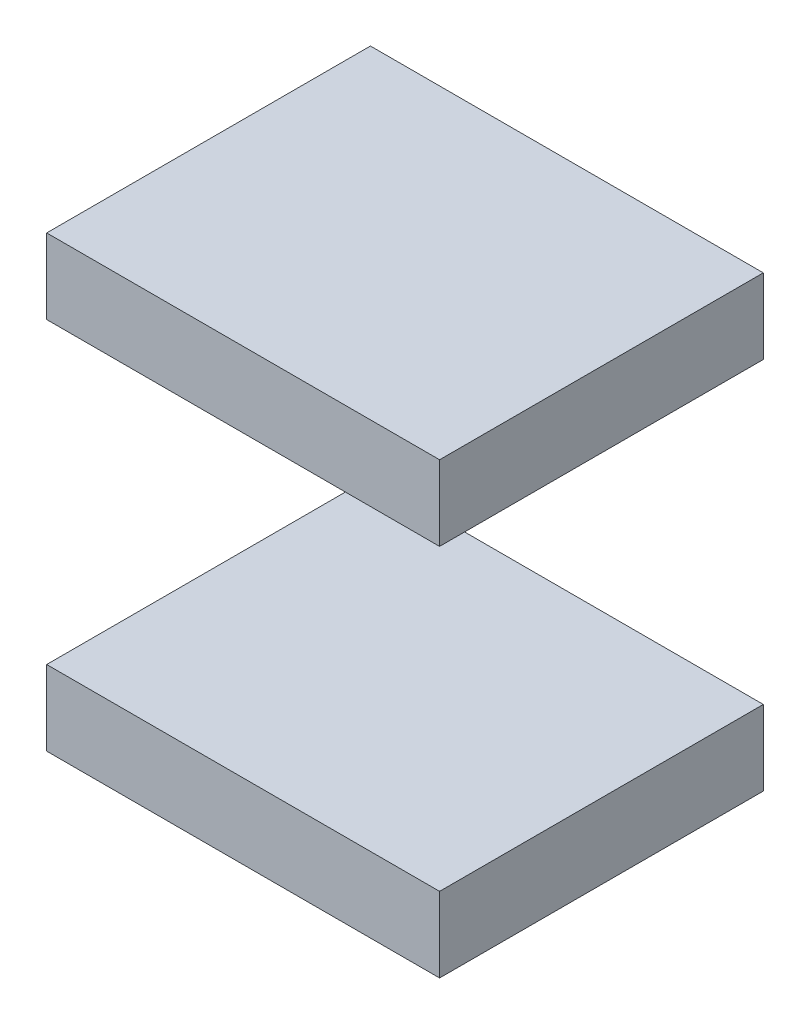
ISO-10303-21;
HEADER;
FILE_DESCRIPTION(('STEP AP214'),'2;1');
FILE_NAME('part.step','',(''),(''),'','','');
FILE_SCHEMA(('AUTOMOTIVE_DESIGN { 1 0 10303 214 1 1 1 1 }'));
ENDSEC;
DATA;
#1=APPLICATION_CONTEXT('core data for automotive mechanical design processes');
#2=APPLICATION_PROTOCOL_DEFINITION('international standard','automotive_design',2000,#1);
#3=PRODUCT_CONTEXT('',#1,'mechanical');
#4=PRODUCT('Part','Part','',(#3));
#5=PRODUCT_RELATED_PRODUCT_CATEGORY('part','',(#4));
#6=PRODUCT_DEFINITION_FORMATION('','',#4);
#7=PRODUCT_DEFINITION_CONTEXT('part definition',#1,'design');
#8=PRODUCT_DEFINITION('design','',#6,#7);
#9=PRODUCT_DEFINITION_SHAPE('','',#8);
#10=(LENGTH_UNIT() NAMED_UNIT(*) SI_UNIT(.MILLI.,.METRE.));
#11=(NAMED_UNIT(*) PLANE_ANGLE_UNIT() SI_UNIT($,.RADIAN.));
#12=(NAMED_UNIT(*) SI_UNIT($,.STERADIAN.) SOLID_ANGLE_UNIT());
#13=UNCERTAINTY_MEASURE_WITH_UNIT(LENGTH_MEASURE(1.E-05),#10,'distance_accuracy_value','');
#14=(GEOMETRIC_REPRESENTATION_CONTEXT(3) GLOBAL_UNCERTAINTY_ASSIGNED_CONTEXT((#13)) GLOBAL_UNIT_ASSIGNED_CONTEXT((#10,
#11,#12)) REPRESENTATION_CONTEXT('',''));
#15=CARTESIAN_POINT('',(0.,0.,0.));
#16=DIRECTION('',(0.,0.,1.));
#17=DIRECTION('',(1.,0.,0.));
#18=AXIS2_PLACEMENT_3D('',#15,#16,#17);
#19=CARTESIAN_POINT('',(53.665001201815,72.02500058408,0.));
#20=DIRECTION('',(-1.19248806385E-08,1.,0.));
#21=DIRECTION('',(-1.,-1.19248806385E-08,0.));
#22=AXIS2_PLACEMENT_3D('',#19,#20,#21);
#23=PLANE('',#22);
#24=DIRECTION('',(1.,0.,0.));
#25=VECTOR('',#24,1.);
#26=CARTESIAN_POINT('',(58.665001198953,72.02500061592,2.4));
#27=LINE('',#26,#25);
#28=CARTESIAN_POINT('',(56.3350012033352,72.0250006159199,2.4));
#29=VERTEX_POINT('',#28);
#30=CARTESIAN_POINT('',(53.665001201815,72.0250006,2.4));
#31=VERTEX_POINT('',#30);
#32=EDGE_CURVE('P0_E56',#29,#31,#27,.F.);
#33=ORIENTED_EDGE('',*,*,#32,.F.);
#34=DIRECTION('',(0.,0.,1.));
#35=VECTOR('',#34,1.);
#36=CARTESIAN_POINT('',(56.335001201815,72.02500061592,0.));
#37=LINE('',#36,#35);
#38=CARTESIAN_POINT('',(56.3350012033352,72.0250006159199,0.2));
#39=VERTEX_POINT('',#38);
#40=EDGE_CURVE('P0_E20',#39,#29,#37,.T.);
#41=ORIENTED_EDGE('',*,*,#40,.F.);
#42=DIRECTION('',(1.,0.,0.));
#43=VECTOR('',#42,1.);
#44=CARTESIAN_POINT('',(51.335001244227,72.02500061592,0.2));
#45=LINE('',#44,#43);
#46=CARTESIAN_POINT('',(53.665001201815,72.02500059204,0.2));
#47=VERTEX_POINT('',#46);
#48=EDGE_CURVE('P0_E80',#39,#47,#45,.F.);
#49=ORIENTED_EDGE('',*,*,#48,.T.);
#50=DIRECTION('',(0.,0.,1.));
#51=VECTOR('',#50,1.);
#52=CARTESIAN_POINT('',(53.6650012018149,72.02500058408,0.));
#53=LINE('',#52,#51);
#54=EDGE_CURVE('P0_E68',#31,#47,#53,.F.);
#55=ORIENTED_EDGE('',*,*,#54,.F.);
#56=EDGE_LOOP('',(#33,#41,#49,#55));
#57=FACE_BOUND('',#56,.T.);
#58=ADVANCED_FACE('P0_F17',(#57),#23,.T.);
#59=CARTESIAN_POINT('',(56.335001201815,72.02500061592,0.));
#60=DIRECTION('',(1.,1.19248806385E-08,0.));
#61=DIRECTION('',(-1.19248806385E-08,1.,0.));
#62=AXIS2_PLACEMENT_3D('',#59,#60,#61);
#63=PLANE('',#62);
#64=DIRECTION('',(0.,1.,0.));
#65=VECTOR('',#64,1.);
#66=CARTESIAN_POINT('',(56.335001207896,72.265000643705,2.4));
#67=LINE('',#66,#65);
#68=CARTESIAN_POINT('',(56.3350012078963,71.51500060796,2.4));
#69=VERTEX_POINT('',#68);
#70=EDGE_CURVE('P0_E62',#69,#29,#67,.T.);
#71=ORIENTED_EDGE('',*,*,#70,.F.);
#72=DIRECTION('',(0.,0.,1.));
#73=VECTOR('',#72,1.);
#74=CARTESIAN_POINT('',(56.335001207896,71.51500061592,2.57));
#75=LINE('',#74,#73);
#76=CARTESIAN_POINT('',(56.3350012078963,71.51500060796,0.2));
#77=VERTEX_POINT('',#76);
#78=EDGE_CURVE('P0_E83',#77,#69,#75,.T.);
#79=ORIENTED_EDGE('',*,*,#78,.F.);
#80=DIRECTION('',(0.,1.,0.));
#81=VECTOR('',#80,1.);
#82=CARTESIAN_POINT('',(56.335001207896,68.468354556295,0.199999999999999));
#83=LINE('',#82,#81);
#84=EDGE_CURVE('P0_E65',#77,#39,#83,.T.);
#85=ORIENTED_EDGE('',*,*,#84,.T.);
#86=ORIENTED_EDGE('',*,*,#40,.T.);
#87=EDGE_LOOP('',(#71,#79,#85,#86));
#88=FACE_BOUND('',#87,.T.);
#89=ADVANCED_FACE('P0_F61',(#88),#63,.T.);
#90=CARTESIAN_POINT('',(58.665001198953,72.265000643705,2.4));
#91=DIRECTION('',(0.,0.,1.));
#92=DIRECTION('',(1.,0.,0.));
#93=AXIS2_PLACEMENT_3D('',#90,#91,#92);
#94=PLANE('',#93);
#95=DIRECTION('',(1.19248806385E-08,-1.,0.));
#96=VECTOR('',#95,1.);
#97=CARTESIAN_POINT('',(53.665001241167,68.72500058408,2.4));
#98=LINE('',#97,#96);
#99=CARTESIAN_POINT('',(53.6650012048556,71.5150005840802,2.4));
#100=VERTEX_POINT('',#99);
#101=EDGE_CURVE('P0_E70',#100,#31,#98,.F.);
#102=ORIENTED_EDGE('',*,*,#101,.F.);
#103=DIRECTION('',(1.,1.19248806385E-08,0.));
#104=VECTOR('',#103,1.);
#105=CARTESIAN_POINT('',(58.665001207896,71.515000643705,2.4));
#106=LINE('',#105,#104);
#107=EDGE_CURVE('P0_E74',#69,#100,#106,.F.);
#108=ORIENTED_EDGE('',*,*,#107,.F.);
#109=ORIENTED_EDGE('',*,*,#70,.T.);
#110=ORIENTED_EDGE('',*,*,#32,.T.);
#111=EDGE_LOOP('',(#102,#108,#109,#110));
#112=FACE_BOUND('',#111,.T.);
#113=ADVANCED_FACE('P0_F72',(#112),#94,.T.);
#114=CARTESIAN_POINT('',(53.665001241167,68.72500058408,0.));
#115=DIRECTION('',(-1.,-1.19248806385E-08,0.));
#116=DIRECTION('',(1.19248806385E-08,-1.,0.));
#117=AXIS2_PLACEMENT_3D('',#114,#115,#116);
#118=PLANE('',#117);
#119=ORIENTED_EDGE('',*,*,#101,.T.);
#120=ORIENTED_EDGE('',*,*,#54,.T.);
#121=DIRECTION('',(0.,1.,0.));
#122=VECTOR('',#121,1.);
#123=CARTESIAN_POINT('',(53.665001201815,68.468354556295,0.199999999999999));
#124=LINE('',#123,#122);
#125=CARTESIAN_POINT('',(53.665001206376,71.5150005840802,0.2));
#126=VERTEX_POINT('',#125);
#127=EDGE_CURVE('P0_E35',#47,#126,#124,.F.);
#128=ORIENTED_EDGE('',*,*,#127,.T.);
#129=DIRECTION('',(0.,0.,1.));
#130=VECTOR('',#129,1.);
#131=CARTESIAN_POINT('',(53.665001207896,71.5150005840806,2.57));
#132=LINE('',#131,#130);
#133=EDGE_CURVE('P0_E26',#100,#126,#132,.F.);
#134=ORIENTED_EDGE('',*,*,#133,.F.);
#135=EDGE_LOOP('',(#119,#120,#128,#134));
#136=FACE_BOUND('',#135,.T.);
#137=ADVANCED_FACE('P0_F89',(#136),#118,.T.);
#138=CARTESIAN_POINT('',(51.335001244227,68.468354556295,0.2));
#139=DIRECTION('',(0.,0.,1.));
#140=DIRECTION('',(1.,0.,0.));
#141=AXIS2_PLACEMENT_3D('',#138,#139,#140);
#142=PLANE('',#141);
#143=ORIENTED_EDGE('',*,*,#127,.F.);
#144=ORIENTED_EDGE('',*,*,#48,.F.);
#145=ORIENTED_EDGE('',*,*,#84,.F.);
#146=DIRECTION('',(1.,1.19248806385E-08,0.));
#147=VECTOR('',#146,1.);
#148=CARTESIAN_POINT('',(58.665001207896,71.515000643705,0.199999999999999));
#149=LINE('',#148,#147);
#150=EDGE_CURVE('P0_E11',#126,#77,#149,.T.);
#151=ORIENTED_EDGE('',*,*,#150,.F.);
#152=EDGE_LOOP('',(#143,#144,#145,#151));
#153=FACE_BOUND('',#152,.T.);
#154=ADVANCED_FACE('P0_F91',(#153),#142,.F.);
#155=CARTESIAN_POINT('',(58.665001207896,71.515000643705,2.57));
#156=DIRECTION('',(1.19248806385E-08,-1.,0.));
#157=DIRECTION('',(1.,1.19248806385E-08,0.));
#158=AXIS2_PLACEMENT_3D('',#155,#156,#157);
#159=PLANE('',#158);
#160=ORIENTED_EDGE('',*,*,#133,.T.);
#161=ORIENTED_EDGE('',*,*,#150,.T.);
#162=ORIENTED_EDGE('',*,*,#78,.T.);
#163=ORIENTED_EDGE('',*,*,#107,.T.);
#164=EDGE_LOOP('',(#160,#161,#162,#163));
#165=FACE_BOUND('',#164,.T.);
#166=ADVANCED_FACE('P0_F88',(#165),#159,.T.);
#167=CLOSED_SHELL('',(#58,#89,#113,#137,#154,#166));
#168=MANIFOLD_SOLID_BREP('P0_B1',#167);
#169=CARTESIAN_POINT('',(58.665001232104,69.485000643705,2.57));
#170=DIRECTION('',(1.19248806385E-08,-1.,0.));
#171=DIRECTION('',(1.,1.19248806385E-08,0.));
#172=AXIS2_PLACEMENT_3D('',#169,#170,#171);
#173=PLANE('',#172);
#174=DIRECTION('',(0.,0.,1.));
#175=VECTOR('',#174,1.);
#176=CARTESIAN_POINT('',(53.6650012321033,69.48500058408,0.));
#177=LINE('',#176,#175);
#178=CARTESIAN_POINT('',(53.6650012321038,69.4850006000001,2.4));
#179=VERTEX_POINT('',#178);
#180=CARTESIAN_POINT('',(53.6650012321038,69.4850006000001,0.2));
#181=VERTEX_POINT('',#180);
#182=EDGE_CURVE('P1_E81',#179,#181,#177,.F.);
#183=ORIENTED_EDGE('',*,*,#182,.F.);
#184=DIRECTION('',(1.,0.,0.));
#185=VECTOR('',#184,1.);
#186=CARTESIAN_POINT('',(58.665001195971,69.48500061592,2.4));
#187=LINE('',#186,#185);
#188=CARTESIAN_POINT('',(56.335001233624,69.48500061592,2.4));
#189=VERTEX_POINT('',#188);
#190=EDGE_CURVE('P1_E68',#189,#179,#187,.F.);
#191=ORIENTED_EDGE('',*,*,#190,.F.);
#192=DIRECTION('',(0.,0.,1.));
#193=VECTOR('',#192,1.);
#194=CARTESIAN_POINT('',(56.3350012321034,69.48500061592,0.));
#195=LINE('',#194,#193);
#196=CARTESIAN_POINT('',(56.3350012351444,69.48500061592,0.199999999999999));
#197=VERTEX_POINT('',#196);
#198=EDGE_CURVE('P1_E55',#197,#189,#195,.T.);
#199=ORIENTED_EDGE('',*,*,#198,.F.);
#200=DIRECTION('',(1.,0.,0.));
#201=VECTOR('',#200,1.);
#202=CARTESIAN_POINT('',(51.335001241246,69.48500061592,0.2));
#203=LINE('',#202,#201);
#204=EDGE_CURVE('P1_E20',#197,#181,#203,.F.);
#205=ORIENTED_EDGE('',*,*,#204,.T.);
#206=EDGE_LOOP('',(#183,#191,#199,#205));
#207=FACE_BOUND('',#206,.T.);
#208=ADVANCED_FACE('P1_F17',(#207),#173,.F.);
#209=CARTESIAN_POINT('',(51.335001241246,68.718354556295,0.2));
#210=DIRECTION('',(0.,0.,1.));
#211=DIRECTION('',(1.,0.,0.));
#212=AXIS2_PLACEMENT_3D('',#209,#210,#211);
#213=PLANE('',#212);
#214=DIRECTION('',(1.19248806385E-08,-1.,0.));
#215=VECTOR('',#214,1.);
#216=CARTESIAN_POINT('',(53.665001238185,68.97500058408,0.2));
#217=LINE('',#216,#215);
#218=CARTESIAN_POINT('',(53.6650012351445,68.9750005840801,0.2));
#219=VERTEX_POINT('',#218);
#220=EDGE_CURVE('P1_E64',#181,#219,#217,.T.);
#221=ORIENTED_EDGE('',*,*,#220,.F.);
#222=ORIENTED_EDGE('',*,*,#204,.F.);
#223=DIRECTION('',(-1.19248806385E-08,1.,0.));
#224=VECTOR('',#223,1.);
#225=CARTESIAN_POINT('',(56.335001198833,72.27500061592,0.2));
#226=LINE('',#225,#224);
#227=CARTESIAN_POINT('',(56.335001238185,68.9750006,0.2));
#228=VERTEX_POINT('',#227);
#229=EDGE_CURVE('P1_E61',#228,#197,#226,.T.);
#230=ORIENTED_EDGE('',*,*,#229,.F.);
#231=DIRECTION('',(1.,1.19248806385E-08,0.));
#232=VECTOR('',#231,1.);
#233=CARTESIAN_POINT('',(56.335001238185,68.97500061592,0.2));
#234=LINE('',#233,#232);
#235=EDGE_CURVE('P1_E83',#219,#228,#234,.T.);
#236=ORIENTED_EDGE('',*,*,#235,.F.);
#237=EDGE_LOOP('',(#221,#222,#230,#236));
#238=FACE_BOUND('',#237,.T.);
#239=ADVANCED_FACE('P1_F60',(#238),#213,.F.);
#240=CARTESIAN_POINT('',(56.335001198833,72.27500061592,0.));
#241=DIRECTION('',(1.,1.19248806385E-08,0.));
#242=DIRECTION('',(-1.19248806385E-08,1.,0.));
#243=AXIS2_PLACEMENT_3D('',#240,#241,#242);
#244=PLANE('',#243);
#245=DIRECTION('',(0.,1.,0.));
#246=VECTOR('',#245,1.);
#247=CARTESIAN_POINT('',(56.335001238185,72.515000643705,2.4));
#248=LINE('',#247,#246);
#249=CARTESIAN_POINT('',(56.3350012381851,68.97500060796,2.4));
#250=VERTEX_POINT('',#249);
#251=EDGE_CURVE('P1_E70',#250,#189,#248,.T.);
#252=ORIENTED_EDGE('',*,*,#251,.F.);
#253=DIRECTION('',(0.,0.,1.));
#254=VECTOR('',#253,1.);
#255=CARTESIAN_POINT('',(56.335001238185,68.97500061592,0.));
#256=LINE('',#255,#254);
#257=EDGE_CURVE('P1_E74',#228,#250,#256,.T.);
#258=ORIENTED_EDGE('',*,*,#257,.F.);
#259=ORIENTED_EDGE('',*,*,#229,.T.);
#260=ORIENTED_EDGE('',*,*,#198,.T.);
#261=EDGE_LOOP('',(#252,#258,#259,#260));
#262=FACE_BOUND('',#261,.T.);
#263=ADVANCED_FACE('P1_F72',(#262),#244,.T.);
#264=CARTESIAN_POINT('',(58.665001195971,72.515000643705,2.4));
#265=DIRECTION('',(0.,0.,1.));
#266=DIRECTION('',(1.,0.,0.));
#267=AXIS2_PLACEMENT_3D('',#264,#265,#266);
#268=PLANE('',#267);
#269=DIRECTION('',(1.19248806385E-08,-1.,0.));
#270=VECTOR('',#269,1.);
#271=CARTESIAN_POINT('',(53.665001238185,68.97500058408,2.4));
#272=LINE('',#271,#270);
#273=CARTESIAN_POINT('',(53.6650012351445,68.9750005840801,2.4));
#274=VERTEX_POINT('',#273);
#275=EDGE_CURVE('P1_E35',#274,#179,#272,.F.);
#276=ORIENTED_EDGE('',*,*,#275,.F.);
#277=DIRECTION('',(1.,1.19248806385E-08,0.));
#278=VECTOR('',#277,1.);
#279=CARTESIAN_POINT('',(56.335001238185,68.97500061592,2.4));
#280=LINE('',#279,#278);
#281=EDGE_CURVE('P1_E26',#250,#274,#280,.F.);
#282=ORIENTED_EDGE('',*,*,#281,.F.);
#283=ORIENTED_EDGE('',*,*,#251,.T.);
#284=ORIENTED_EDGE('',*,*,#190,.T.);
#285=EDGE_LOOP('',(#276,#282,#283,#284));
#286=FACE_BOUND('',#285,.T.);
#287=ADVANCED_FACE('P1_F89',(#286),#268,.T.);
#288=CARTESIAN_POINT('',(53.665001238185,68.97500058408,0.));
#289=DIRECTION('',(-1.,-1.19248806385E-08,0.));
#290=DIRECTION('',(1.19248806385E-08,-1.,0.));
#291=AXIS2_PLACEMENT_3D('',#288,#289,#290);
#292=PLANE('',#291);
#293=ORIENTED_EDGE('',*,*,#275,.T.);
#294=ORIENTED_EDGE('',*,*,#182,.T.);
#295=ORIENTED_EDGE('',*,*,#220,.T.);
#296=DIRECTION('',(0.,0.,1.));
#297=VECTOR('',#296,1.);
#298=CARTESIAN_POINT('',(53.665001238185,68.9750005840806,0.));
#299=LINE('',#298,#297);
#300=EDGE_CURVE('P1_E11',#274,#219,#299,.F.);
#301=ORIENTED_EDGE('',*,*,#300,.F.);
#302=EDGE_LOOP('',(#293,#294,#295,#301));
#303=FACE_BOUND('',#302,.T.);
#304=ADVANCED_FACE('P1_F91',(#303),#292,.T.);
#305=CARTESIAN_POINT('',(56.335001238185,68.97500061592,0.));
#306=DIRECTION('',(1.19248806385E-08,-1.,0.));
#307=DIRECTION('',(1.,1.19248806385E-08,0.));
#308=AXIS2_PLACEMENT_3D('',#305,#306,#307);
#309=PLANE('',#308);
#310=ORIENTED_EDGE('',*,*,#281,.T.);
#311=ORIENTED_EDGE('',*,*,#300,.T.);
#312=ORIENTED_EDGE('',*,*,#235,.T.);
#313=ORIENTED_EDGE('',*,*,#257,.T.);
#314=EDGE_LOOP('',(#310,#311,#312,#313));
#315=FACE_BOUND('',#314,.T.);
#316=ADVANCED_FACE('P1_F88',(#315),#309,.T.);
#317=CLOSED_SHELL('',(#208,#239,#263,#287,#304,#316));
#318=MANIFOLD_SOLID_BREP('P1_B1',#317);
#319=ADVANCED_BREP_SHAPE_REPRESENTATION('',(#18,#168,#318),#14);
#320=SHAPE_DEFINITION_REPRESENTATION(#9,#319);
ENDSEC;
END-ISO-10303-21;
